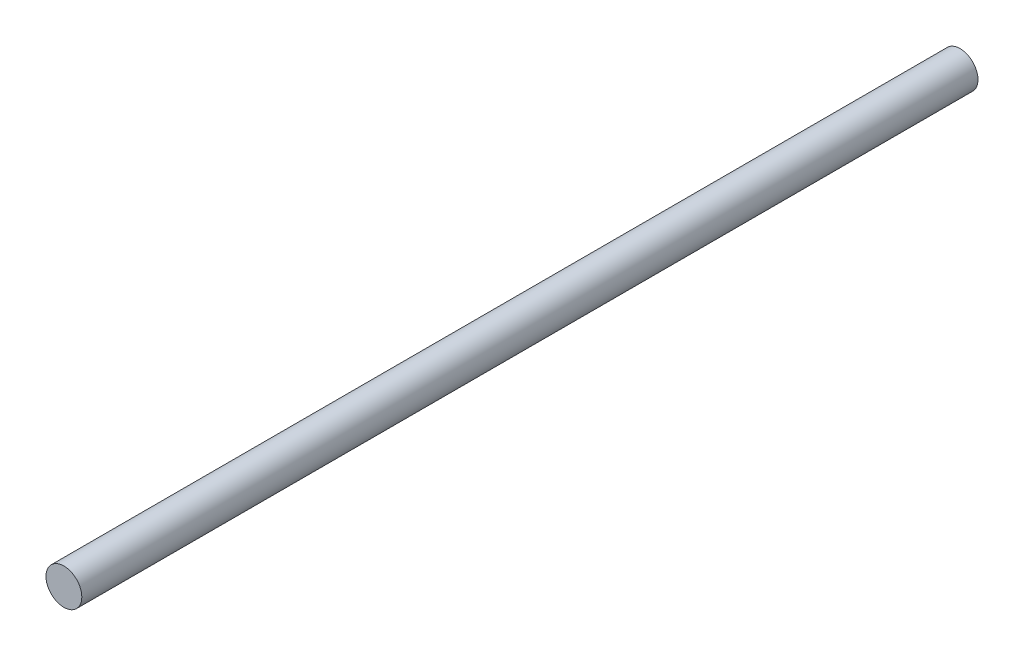
ISO-10303-21;
HEADER;
FILE_DESCRIPTION(('STEP AP214'),'2;1');
FILE_NAME('part.step','',(''),(''),'','','');
FILE_SCHEMA(('AUTOMOTIVE_DESIGN { 1 0 10303 214 1 1 1 1 }'));
ENDSEC;
DATA;
#1=APPLICATION_CONTEXT('core data for automotive mechanical design processes');
#2=APPLICATION_PROTOCOL_DEFINITION('international standard','automotive_design',2000,#1);
#3=PRODUCT_CONTEXT('',#1,'mechanical');
#4=PRODUCT('Part','Part','',(#3));
#5=PRODUCT_RELATED_PRODUCT_CATEGORY('part','',(#4));
#6=PRODUCT_DEFINITION_FORMATION('','',#4);
#7=PRODUCT_DEFINITION_CONTEXT('part definition',#1,'design');
#8=PRODUCT_DEFINITION('design','',#6,#7);
#9=PRODUCT_DEFINITION_SHAPE('','',#8);
#10=(LENGTH_UNIT() NAMED_UNIT(*) SI_UNIT(.MILLI.,.METRE.));
#11=(NAMED_UNIT(*) PLANE_ANGLE_UNIT() SI_UNIT($,.RADIAN.));
#12=(NAMED_UNIT(*) SI_UNIT($,.STERADIAN.) SOLID_ANGLE_UNIT());
#13=UNCERTAINTY_MEASURE_WITH_UNIT(LENGTH_MEASURE(1.E-05),#10,'distance_accuracy_value','');
#14=(GEOMETRIC_REPRESENTATION_CONTEXT(3) GLOBAL_UNCERTAINTY_ASSIGNED_CONTEXT((#13)) GLOBAL_UNIT_ASSIGNED_CONTEXT((#10,
#11,#12)) REPRESENTATION_CONTEXT('',''));
#15=CARTESIAN_POINT('',(0.,0.,0.));
#16=DIRECTION('',(0.,0.,1.));
#17=DIRECTION('',(1.,0.,0.));
#18=AXIS2_PLACEMENT_3D('',#15,#16,#17);
#19=CARTESIAN_POINT('',(125.53479172773,68.065682512522,150.));
#20=DIRECTION('',(0.,0.,-1.));
#21=DIRECTION('',(-1.,0.,0.));
#22=AXIS2_PLACEMENT_3D('',#19,#20,#21);
#23=CYLINDRICAL_SURFACE('',#22,2.99999999999999);
#24=CARTESIAN_POINT('',(125.53479172773,68.065682512522,150.));
#25=DIRECTION('',(0.,0.,1.));
#26=DIRECTION('',(1.,0.,0.));
#27=AXIS2_PLACEMENT_3D('',#24,#25,#26);
#28=CIRCLE('',#27,2.99999999999999);
#29=CARTESIAN_POINT('',(128.53479172773,68.065682512522,150.));
#30=VERTEX_POINT('',#29);
#31=EDGE_CURVE('E10',#30,#30,#28,.T.);
#32=ORIENTED_EDGE('',*,*,#31,.F.);
#33=EDGE_LOOP('',(#32));
#34=FACE_BOUND('',#33,.T.);
#35=CARTESIAN_POINT('',(125.53479172773,68.065682512522,0.));
#36=DIRECTION('',(0.,0.,1.));
#37=DIRECTION('',(1.,0.,0.));
#38=AXIS2_PLACEMENT_3D('',#35,#36,#37);
#39=CIRCLE('',#38,2.99999999999999);
#40=CARTESIAN_POINT('',(128.53479172773,68.065682512522,0.));
#41=VERTEX_POINT('',#40);
#42=EDGE_CURVE('E42',#41,#41,#39,.T.);
#43=ORIENTED_EDGE('',*,*,#42,.T.);
#44=EDGE_LOOP('',(#43));
#45=FACE_BOUND('',#44,.T.);
#46=ADVANCED_FACE('F39',(#34,#45),#23,.T.);
#47=CARTESIAN_POINT('',(125.53479172773,68.065682512522,150.));
#48=DIRECTION('',(0.,0.,1.));
#49=DIRECTION('',(1.,0.,0.));
#50=AXIS2_PLACEMENT_3D('',#47,#48,#49);
#51=PLANE('',#50);
#52=ORIENTED_EDGE('',*,*,#31,.T.);
#53=EDGE_LOOP('',(#52));
#54=FACE_BOUND('',#53,.T.);
#55=ADVANCED_FACE('F55',(#54),#51,.T.);
#56=CARTESIAN_POINT('',(125.53479172773,68.065682512522,0.));
#57=DIRECTION('',(0.,0.,1.));
#58=DIRECTION('',(1.,0.,0.));
#59=AXIS2_PLACEMENT_3D('',#56,#57,#58);
#60=PLANE('',#59);
#61=ORIENTED_EDGE('',*,*,#42,.F.);
#62=EDGE_LOOP('',(#61));
#63=FACE_BOUND('',#62,.T.);
#64=ADVANCED_FACE('F53',(#63),#60,.F.);
#65=CLOSED_SHELL('',(#46,#55,#64));
#66=MANIFOLD_SOLID_BREP('B2',#65);
#67=ADVANCED_BREP_SHAPE_REPRESENTATION('',(#18,#66),#14);
#68=SHAPE_DEFINITION_REPRESENTATION(#9,#67);
ENDSEC;
END-ISO-10303-21;
